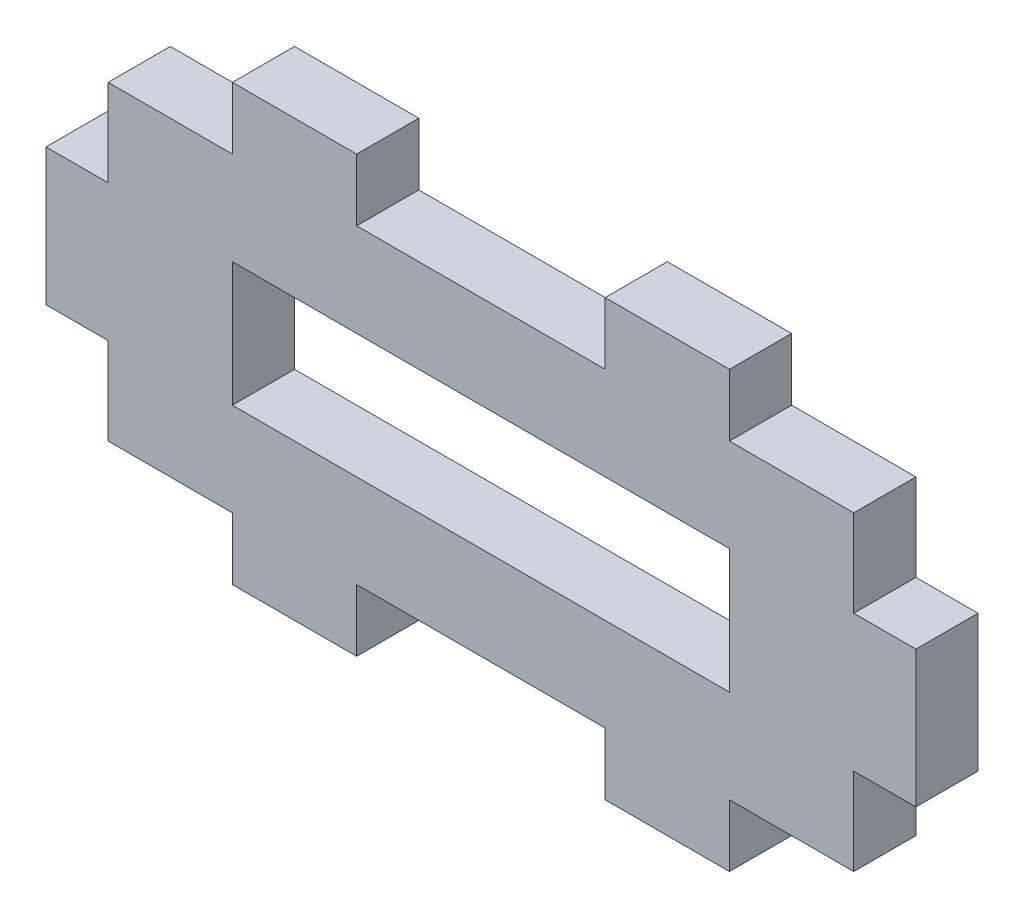
ISO-10303-21;
HEADER;
FILE_DESCRIPTION(('STEP AP214'),'2;1');
FILE_NAME('part.step','',(''),(''),'','','');
FILE_SCHEMA(('AUTOMOTIVE_DESIGN { 1 0 10303 214 1 1 1 1 }'));
ENDSEC;
DATA;
#1=APPLICATION_CONTEXT('core data for automotive mechanical design processes');
#2=APPLICATION_PROTOCOL_DEFINITION('international standard','automotive_design',2000,#1);
#3=PRODUCT_CONTEXT('',#1,'mechanical');
#4=PRODUCT('Part','Part','',(#3));
#5=PRODUCT_RELATED_PRODUCT_CATEGORY('part','',(#4));
#6=PRODUCT_DEFINITION_FORMATION('','',#4);
#7=PRODUCT_DEFINITION_CONTEXT('part definition',#1,'design');
#8=PRODUCT_DEFINITION('design','',#6,#7);
#9=PRODUCT_DEFINITION_SHAPE('','',#8);
#10=(LENGTH_UNIT() NAMED_UNIT(*) SI_UNIT(.MILLI.,.METRE.));
#11=(NAMED_UNIT(*) PLANE_ANGLE_UNIT() SI_UNIT($,.RADIAN.));
#12=(NAMED_UNIT(*) SI_UNIT($,.STERADIAN.) SOLID_ANGLE_UNIT());
#13=UNCERTAINTY_MEASURE_WITH_UNIT(LENGTH_MEASURE(1.E-05),#10,'distance_accuracy_value','');
#14=(GEOMETRIC_REPRESENTATION_CONTEXT(3) GLOBAL_UNCERTAINTY_ASSIGNED_CONTEXT((#13)) GLOBAL_UNIT_ASSIGNED_CONTEXT((#10,
#11,#12)) REPRESENTATION_CONTEXT('',''));
#15=CARTESIAN_POINT('',(0.,0.,0.));
#16=DIRECTION('',(0.,0.,1.));
#17=DIRECTION('',(1.,0.,0.));
#18=AXIS2_PLACEMENT_3D('',#15,#16,#17);
#19=CARTESIAN_POINT('',(0.,0.,5.));
#20=DIRECTION('',(0.,0.,-1.));
#21=DIRECTION('',(-1.,0.,0.));
#22=AXIS2_PLACEMENT_3D('',#19,#20,#21);
#23=PLANE('',#22);
#24=DIRECTION('',(0.,1.,0.));
#25=VECTOR('',#24,1.);
#26=CARTESIAN_POINT('',(30.,5.5,5.));
#27=LINE('',#26,#25);
#28=CARTESIAN_POINT('',(30.,5.5,5.));
#29=VERTEX_POINT('',#28);
#30=CARTESIAN_POINT('',(30.,12.5,5.));
#31=VERTEX_POINT('',#30);
#32=EDGE_CURVE('E278',#29,#31,#27,.T.);
#33=ORIENTED_EDGE('',*,*,#32,.T.);
#34=DIRECTION('',(-1.,0.,0.));
#35=VECTOR('',#34,1.);
#36=CARTESIAN_POINT('',(20.,12.5,5.));
#37=LINE('',#36,#35);
#38=CARTESIAN_POINT('',(20.,12.5,5.));
#39=VERTEX_POINT('',#38);
#40=EDGE_CURVE('E281',#31,#39,#37,.T.);
#41=ORIENTED_EDGE('',*,*,#40,.T.);
#42=DIRECTION('',(0.,1.,0.));
#43=VECTOR('',#42,1.);
#44=CARTESIAN_POINT('',(20.,12.5,5.));
#45=LINE('',#44,#43);
#46=CARTESIAN_POINT('',(20.,17.5,5.));
#47=VERTEX_POINT('',#46);
#48=EDGE_CURVE('E284',#39,#47,#45,.T.);
#49=ORIENTED_EDGE('',*,*,#48,.T.);
#50=DIRECTION('',(-1.,0.,0.));
#51=VECTOR('',#50,1.);
#52=CARTESIAN_POINT('',(20.,17.5,5.));
#53=LINE('',#52,#51);
#54=CARTESIAN_POINT('',(9.99999999999998,17.5,5.));
#55=VERTEX_POINT('',#54);
#56=EDGE_CURVE('E286',#47,#55,#53,.T.);
#57=ORIENTED_EDGE('',*,*,#56,.T.);
#58=DIRECTION('',(0.,-1.,0.));
#59=VECTOR('',#58,1.);
#60=CARTESIAN_POINT('',(9.99999999999998,12.5,5.));
#61=LINE('',#60,#59);
#62=CARTESIAN_POINT('',(9.99999999999998,12.5,5.));
#63=VERTEX_POINT('',#62);
#64=EDGE_CURVE('E288',#55,#63,#61,.T.);
#65=ORIENTED_EDGE('',*,*,#64,.T.);
#66=DIRECTION('',(-1.,0.,0.));
#67=VECTOR('',#66,1.);
#68=CARTESIAN_POINT('',(-10.,12.5,5.));
#69=LINE('',#68,#67);
#70=CARTESIAN_POINT('',(-10.,12.5,5.));
#71=VERTEX_POINT('',#70);
#72=EDGE_CURVE('E290',#63,#71,#69,.T.);
#73=ORIENTED_EDGE('',*,*,#72,.T.);
#74=DIRECTION('',(0.,1.,0.));
#75=VECTOR('',#74,1.);
#76=CARTESIAN_POINT('',(-10.,12.5,5.));
#77=LINE('',#76,#75);
#78=CARTESIAN_POINT('',(-10.,17.5,5.));
#79=VERTEX_POINT('',#78);
#80=EDGE_CURVE('E292',#71,#79,#77,.T.);
#81=ORIENTED_EDGE('',*,*,#80,.T.);
#82=DIRECTION('',(-1.,0.,0.));
#83=VECTOR('',#82,1.);
#84=CARTESIAN_POINT('',(-20.,17.5,5.));
#85=LINE('',#84,#83);
#86=CARTESIAN_POINT('',(-20.,17.5,5.));
#87=VERTEX_POINT('',#86);
#88=EDGE_CURVE('E294',#79,#87,#85,.T.);
#89=ORIENTED_EDGE('',*,*,#88,.T.);
#90=DIRECTION('',(0.,-1.,0.));
#91=VECTOR('',#90,1.);
#92=CARTESIAN_POINT('',(-20.,12.5,5.));
#93=LINE('',#92,#91);
#94=CARTESIAN_POINT('',(-20.,12.5,5.));
#95=VERTEX_POINT('',#94);
#96=EDGE_CURVE('E296',#87,#95,#93,.T.);
#97=ORIENTED_EDGE('',*,*,#96,.T.);
#98=DIRECTION('',(-1.,0.,0.));
#99=VECTOR('',#98,1.);
#100=CARTESIAN_POINT('',(-30.,12.5,5.));
#101=LINE('',#100,#99);
#102=CARTESIAN_POINT('',(-30.,12.5,5.));
#103=VERTEX_POINT('',#102);
#104=EDGE_CURVE('E298',#95,#103,#101,.T.);
#105=ORIENTED_EDGE('',*,*,#104,.T.);
#106=DIRECTION('',(0.,-1.,0.));
#107=VECTOR('',#106,1.);
#108=CARTESIAN_POINT('',(-30.,5.5,5.));
#109=LINE('',#108,#107);
#110=CARTESIAN_POINT('',(-30.,5.5,5.));
#111=VERTEX_POINT('',#110);
#112=EDGE_CURVE('E300',#103,#111,#109,.T.);
#113=ORIENTED_EDGE('',*,*,#112,.T.);
#114=DIRECTION('',(-1.,0.,0.));
#115=VECTOR('',#114,1.);
#116=CARTESIAN_POINT('',(-30.,5.5,5.));
#117=LINE('',#116,#115);
#118=CARTESIAN_POINT('',(-35.,5.5,5.));
#119=VERTEX_POINT('',#118);
#120=EDGE_CURVE('E302',#111,#119,#117,.T.);
#121=ORIENTED_EDGE('',*,*,#120,.T.);
#122=DIRECTION('',(0.,-1.,0.));
#123=VECTOR('',#122,1.);
#124=CARTESIAN_POINT('',(-35.,5.5,5.));
#125=LINE('',#124,#123);
#126=CARTESIAN_POINT('',(-35.,-5.5,5.));
#127=VERTEX_POINT('',#126);
#128=EDGE_CURVE('E304',#119,#127,#125,.T.);
#129=ORIENTED_EDGE('',*,*,#128,.T.);
#130=DIRECTION('',(1.,0.,0.));
#131=VECTOR('',#130,1.);
#132=CARTESIAN_POINT('',(-30.,-5.5,5.));
#133=LINE('',#132,#131);
#134=CARTESIAN_POINT('',(-30.,-5.5,5.));
#135=VERTEX_POINT('',#134);
#136=EDGE_CURVE('E306',#127,#135,#133,.T.);
#137=ORIENTED_EDGE('',*,*,#136,.T.);
#138=DIRECTION('',(0.,-1.,0.));
#139=VECTOR('',#138,1.);
#140=CARTESIAN_POINT('',(-30.,-12.5,5.));
#141=LINE('',#140,#139);
#142=CARTESIAN_POINT('',(-30.,-12.5,5.));
#143=VERTEX_POINT('',#142);
#144=EDGE_CURVE('E308',#135,#143,#141,.T.);
#145=ORIENTED_EDGE('',*,*,#144,.T.);
#146=DIRECTION('',(1.,0.,0.));
#147=VECTOR('',#146,1.);
#148=CARTESIAN_POINT('',(-30.,-12.5,5.));
#149=LINE('',#148,#147);
#150=CARTESIAN_POINT('',(-20.,-12.5,5.));
#151=VERTEX_POINT('',#150);
#152=EDGE_CURVE('E310',#143,#151,#149,.T.);
#153=ORIENTED_EDGE('',*,*,#152,.T.);
#154=DIRECTION('',(0.,-1.,0.));
#155=VECTOR('',#154,1.);
#156=CARTESIAN_POINT('',(-20.,-12.5,5.));
#157=LINE('',#156,#155);
#158=CARTESIAN_POINT('',(-20.,-17.5,5.));
#159=VERTEX_POINT('',#158);
#160=EDGE_CURVE('E312',#151,#159,#157,.T.);
#161=ORIENTED_EDGE('',*,*,#160,.T.);
#162=DIRECTION('',(1.,0.,0.));
#163=VECTOR('',#162,1.);
#164=CARTESIAN_POINT('',(-20.,-17.5,5.));
#165=LINE('',#164,#163);
#166=CARTESIAN_POINT('',(-10.,-17.5,5.));
#167=VERTEX_POINT('',#166);
#168=EDGE_CURVE('E314',#159,#167,#165,.T.);
#169=ORIENTED_EDGE('',*,*,#168,.T.);
#170=DIRECTION('',(0.,1.,0.));
#171=VECTOR('',#170,1.);
#172=CARTESIAN_POINT('',(-10.,-12.5,5.));
#173=LINE('',#172,#171);
#174=CARTESIAN_POINT('',(-10.,-12.5,5.));
#175=VERTEX_POINT('',#174);
#176=EDGE_CURVE('E316',#167,#175,#173,.T.);
#177=ORIENTED_EDGE('',*,*,#176,.T.);
#178=DIRECTION('',(1.,0.,0.));
#179=VECTOR('',#178,1.);
#180=CARTESIAN_POINT('',(-10.,-12.5,5.));
#181=LINE('',#180,#179);
#182=CARTESIAN_POINT('',(9.99999999999998,-12.5,5.));
#183=VERTEX_POINT('',#182);
#184=EDGE_CURVE('E318',#175,#183,#181,.T.);
#185=ORIENTED_EDGE('',*,*,#184,.T.);
#186=DIRECTION('',(0.,-1.,0.));
#187=VECTOR('',#186,1.);
#188=CARTESIAN_POINT('',(9.99999999999998,-12.5,5.));
#189=LINE('',#188,#187);
#190=CARTESIAN_POINT('',(9.99999999999998,-17.5,5.));
#191=VERTEX_POINT('',#190);
#192=EDGE_CURVE('E320',#183,#191,#189,.T.);
#193=ORIENTED_EDGE('',*,*,#192,.T.);
#194=DIRECTION('',(1.,0.,0.));
#195=VECTOR('',#194,1.);
#196=CARTESIAN_POINT('',(20.,-17.5,5.));
#197=LINE('',#196,#195);
#198=CARTESIAN_POINT('',(20.,-17.5,5.));
#199=VERTEX_POINT('',#198);
#200=EDGE_CURVE('E322',#191,#199,#197,.T.);
#201=ORIENTED_EDGE('',*,*,#200,.T.);
#202=DIRECTION('',(0.,1.,0.));
#203=VECTOR('',#202,1.);
#204=CARTESIAN_POINT('',(20.,-12.5,5.));
#205=LINE('',#204,#203);
#206=CARTESIAN_POINT('',(20.,-12.5,5.));
#207=VERTEX_POINT('',#206);
#208=EDGE_CURVE('E324',#199,#207,#205,.T.);
#209=ORIENTED_EDGE('',*,*,#208,.T.);
#210=DIRECTION('',(1.,0.,0.));
#211=VECTOR('',#210,1.);
#212=CARTESIAN_POINT('',(20.,-12.5,5.));
#213=LINE('',#212,#211);
#214=CARTESIAN_POINT('',(30.,-12.5,5.));
#215=VERTEX_POINT('',#214);
#216=EDGE_CURVE('E326',#207,#215,#213,.T.);
#217=ORIENTED_EDGE('',*,*,#216,.T.);
#218=DIRECTION('',(0.,1.,0.));
#219=VECTOR('',#218,1.);
#220=CARTESIAN_POINT('',(30.,-12.5,5.));
#221=LINE('',#220,#219);
#222=CARTESIAN_POINT('',(30.,-5.5,5.));
#223=VERTEX_POINT('',#222);
#224=EDGE_CURVE('E328',#215,#223,#221,.T.);
#225=ORIENTED_EDGE('',*,*,#224,.T.);
#226=DIRECTION('',(1.,0.,0.));
#227=VECTOR('',#226,1.);
#228=CARTESIAN_POINT('',(30.,-5.5,5.));
#229=LINE('',#228,#227);
#230=CARTESIAN_POINT('',(35.,-5.5,5.));
#231=VERTEX_POINT('',#230);
#232=EDGE_CURVE('E330',#223,#231,#229,.T.);
#233=ORIENTED_EDGE('',*,*,#232,.T.);
#234=DIRECTION('',(0.,1.,0.));
#235=VECTOR('',#234,1.);
#236=CARTESIAN_POINT('',(35.,5.5,5.));
#237=LINE('',#236,#235);
#238=CARTESIAN_POINT('',(35.,5.5,5.));
#239=VERTEX_POINT('',#238);
#240=EDGE_CURVE('E332',#231,#239,#237,.T.);
#241=ORIENTED_EDGE('',*,*,#240,.T.);
#242=DIRECTION('',(-1.,0.,0.));
#243=VECTOR('',#242,1.);
#244=CARTESIAN_POINT('',(30.,5.5,5.));
#245=LINE('',#244,#243);
#246=EDGE_CURVE('E334',#239,#29,#245,.T.);
#247=ORIENTED_EDGE('',*,*,#246,.T.);
#248=EDGE_LOOP('',(#33,#41,#49,#57,#65,#73,#81,#89,#97,#105,#113,#121,#129,#137,#145,#153,#161,
#169,#177,#185,#193,#201,#209,#217,#225,#233,#241,#247));
#249=FACE_BOUND('',#248,.T.);
#250=DIRECTION('',(0.,1.,0.));
#251=VECTOR('',#250,1.);
#252=CARTESIAN_POINT('',(20.,-5.,5.));
#253=LINE('',#252,#251);
#254=CARTESIAN_POINT('',(20.,-5.,5.));
#255=VERTEX_POINT('',#254);
#256=CARTESIAN_POINT('',(20.,5.,5.));
#257=VERTEX_POINT('',#256);
#258=EDGE_CURVE('E242',#255,#257,#253,.T.);
#259=ORIENTED_EDGE('',*,*,#258,.F.);
#260=DIRECTION('',(1.,0.,0.));
#261=VECTOR('',#260,1.);
#262=CARTESIAN_POINT('',(-20.,-5.,5.));
#263=LINE('',#262,#261);
#264=CARTESIAN_POINT('',(-20.,-5.,5.));
#265=VERTEX_POINT('',#264);
#266=EDGE_CURVE('E264',#265,#255,#263,.T.);
#267=ORIENTED_EDGE('',*,*,#266,.F.);
#268=DIRECTION('',(0.,-1.,0.));
#269=VECTOR('',#268,1.);
#270=CARTESIAN_POINT('',(-20.,-5.,5.));
#271=LINE('',#270,#269);
#272=CARTESIAN_POINT('',(-20.,5.,5.));
#273=VERTEX_POINT('',#272);
#274=EDGE_CURVE('E262',#273,#265,#271,.T.);
#275=ORIENTED_EDGE('',*,*,#274,.F.);
#276=DIRECTION('',(-1.,0.,0.));
#277=VECTOR('',#276,1.);
#278=CARTESIAN_POINT('',(-20.,5.,5.));
#279=LINE('',#278,#277);
#280=EDGE_CURVE('E250',#257,#273,#279,.T.);
#281=ORIENTED_EDGE('',*,*,#280,.F.);
#282=EDGE_LOOP('',(#259,#267,#275,#281));
#283=FACE_BOUND('',#282,.T.);
#284=ADVANCED_FACE('F33',(#249,#283),#23,.F.);
#285=CARTESIAN_POINT('',(0.,0.,0.));
#286=DIRECTION('',(0.,0.,-1.));
#287=DIRECTION('',(-1.,0.,0.));
#288=AXIS2_PLACEMENT_3D('',#285,#286,#287);
#289=PLANE('',#288);
#290=DIRECTION('',(0.,1.,0.));
#291=VECTOR('',#290,1.);
#292=CARTESIAN_POINT('',(30.,5.5,0.));
#293=LINE('',#292,#291);
#294=CARTESIAN_POINT('',(30.,5.5,0.));
#295=VERTEX_POINT('',#294);
#296=CARTESIAN_POINT('',(30.,12.5,0.));
#297=VERTEX_POINT('',#296);
#298=EDGE_CURVE('E258',#295,#297,#293,.T.);
#299=ORIENTED_EDGE('',*,*,#298,.F.);
#300=DIRECTION('',(-1.,0.,0.));
#301=VECTOR('',#300,1.);
#302=CARTESIAN_POINT('',(30.,5.5,0.));
#303=LINE('',#302,#301);
#304=CARTESIAN_POINT('',(35.,5.5,0.));
#305=VERTEX_POINT('',#304);
#306=EDGE_CURVE('E282',#305,#295,#303,.T.);
#307=ORIENTED_EDGE('',*,*,#306,.F.);
#308=DIRECTION('',(0.,1.,0.));
#309=VECTOR('',#308,1.);
#310=CARTESIAN_POINT('',(35.,5.5,0.));
#311=LINE('',#310,#309);
#312=CARTESIAN_POINT('',(35.,-5.5,0.));
#313=VERTEX_POINT('',#312);
#314=EDGE_CURVE('E389',#313,#305,#311,.T.);
#315=ORIENTED_EDGE('',*,*,#314,.F.);
#316=DIRECTION('',(1.,0.,0.));
#317=VECTOR('',#316,1.);
#318=CARTESIAN_POINT('',(30.,-5.5,0.));
#319=LINE('',#318,#317);
#320=CARTESIAN_POINT('',(30.,-5.5,0.));
#321=VERTEX_POINT('',#320);
#322=EDGE_CURVE('E387',#321,#313,#319,.T.);
#323=ORIENTED_EDGE('',*,*,#322,.F.);
#324=DIRECTION('',(0.,1.,0.));
#325=VECTOR('',#324,1.);
#326=CARTESIAN_POINT('',(30.,-12.5,0.));
#327=LINE('',#326,#325);
#328=CARTESIAN_POINT('',(30.,-12.5,0.));
#329=VERTEX_POINT('',#328);
#330=EDGE_CURVE('E385',#329,#321,#327,.T.);
#331=ORIENTED_EDGE('',*,*,#330,.F.);
#332=DIRECTION('',(1.,0.,0.));
#333=VECTOR('',#332,1.);
#334=CARTESIAN_POINT('',(20.,-12.5,0.));
#335=LINE('',#334,#333);
#336=CARTESIAN_POINT('',(20.,-12.5,0.));
#337=VERTEX_POINT('',#336);
#338=EDGE_CURVE('E383',#337,#329,#335,.T.);
#339=ORIENTED_EDGE('',*,*,#338,.F.);
#340=DIRECTION('',(0.,1.,0.));
#341=VECTOR('',#340,1.);
#342=CARTESIAN_POINT('',(20.,-12.5,0.));
#343=LINE('',#342,#341);
#344=CARTESIAN_POINT('',(20.,-17.5,0.));
#345=VERTEX_POINT('',#344);
#346=EDGE_CURVE('E381',#345,#337,#343,.T.);
#347=ORIENTED_EDGE('',*,*,#346,.F.);
#348=DIRECTION('',(1.,0.,0.));
#349=VECTOR('',#348,1.);
#350=CARTESIAN_POINT('',(20.,-17.5,0.));
#351=LINE('',#350,#349);
#352=CARTESIAN_POINT('',(9.99999999999998,-17.5,0.));
#353=VERTEX_POINT('',#352);
#354=EDGE_CURVE('E379',#353,#345,#351,.T.);
#355=ORIENTED_EDGE('',*,*,#354,.F.);
#356=DIRECTION('',(0.,-1.,0.));
#357=VECTOR('',#356,1.);
#358=CARTESIAN_POINT('',(9.99999999999998,-12.5,0.));
#359=LINE('',#358,#357);
#360=CARTESIAN_POINT('',(9.99999999999998,-12.5,0.));
#361=VERTEX_POINT('',#360);
#362=EDGE_CURVE('E377',#361,#353,#359,.T.);
#363=ORIENTED_EDGE('',*,*,#362,.F.);
#364=DIRECTION('',(1.,0.,0.));
#365=VECTOR('',#364,1.);
#366=CARTESIAN_POINT('',(-10.,-12.5,0.));
#367=LINE('',#366,#365);
#368=CARTESIAN_POINT('',(-10.,-12.5,0.));
#369=VERTEX_POINT('',#368);
#370=EDGE_CURVE('E375',#369,#361,#367,.T.);
#371=ORIENTED_EDGE('',*,*,#370,.F.);
#372=DIRECTION('',(0.,1.,0.));
#373=VECTOR('',#372,1.);
#374=CARTESIAN_POINT('',(-10.,-12.5,0.));
#375=LINE('',#374,#373);
#376=CARTESIAN_POINT('',(-10.,-17.5,0.));
#377=VERTEX_POINT('',#376);
#378=EDGE_CURVE('E373',#377,#369,#375,.T.);
#379=ORIENTED_EDGE('',*,*,#378,.F.);
#380=DIRECTION('',(1.,0.,0.));
#381=VECTOR('',#380,1.);
#382=CARTESIAN_POINT('',(-20.,-17.5,0.));
#383=LINE('',#382,#381);
#384=CARTESIAN_POINT('',(-20.,-17.5,0.));
#385=VERTEX_POINT('',#384);
#386=EDGE_CURVE('E371',#385,#377,#383,.T.);
#387=ORIENTED_EDGE('',*,*,#386,.F.);
#388=DIRECTION('',(0.,-1.,0.));
#389=VECTOR('',#388,1.);
#390=CARTESIAN_POINT('',(-20.,-12.5,0.));
#391=LINE('',#390,#389);
#392=CARTESIAN_POINT('',(-20.,-12.5,0.));
#393=VERTEX_POINT('',#392);
#394=EDGE_CURVE('E369',#393,#385,#391,.T.);
#395=ORIENTED_EDGE('',*,*,#394,.F.);
#396=DIRECTION('',(1.,0.,0.));
#397=VECTOR('',#396,1.);
#398=CARTESIAN_POINT('',(-30.,-12.5,0.));
#399=LINE('',#398,#397);
#400=CARTESIAN_POINT('',(-30.,-12.5,0.));
#401=VERTEX_POINT('',#400);
#402=EDGE_CURVE('E367',#401,#393,#399,.T.);
#403=ORIENTED_EDGE('',*,*,#402,.F.);
#404=DIRECTION('',(0.,-1.,0.));
#405=VECTOR('',#404,1.);
#406=CARTESIAN_POINT('',(-30.,-12.5,0.));
#407=LINE('',#406,#405);
#408=CARTESIAN_POINT('',(-30.,-5.5,0.));
#409=VERTEX_POINT('',#408);
#410=EDGE_CURVE('E365',#409,#401,#407,.T.);
#411=ORIENTED_EDGE('',*,*,#410,.F.);
#412=DIRECTION('',(1.,0.,0.));
#413=VECTOR('',#412,1.);
#414=CARTESIAN_POINT('',(-30.,-5.5,0.));
#415=LINE('',#414,#413);
#416=CARTESIAN_POINT('',(-35.,-5.5,0.));
#417=VERTEX_POINT('',#416);
#418=EDGE_CURVE('E363',#417,#409,#415,.T.);
#419=ORIENTED_EDGE('',*,*,#418,.F.);
#420=DIRECTION('',(0.,-1.,0.));
#421=VECTOR('',#420,1.);
#422=CARTESIAN_POINT('',(-35.,5.5,0.));
#423=LINE('',#422,#421);
#424=CARTESIAN_POINT('',(-35.,5.5,0.));
#425=VERTEX_POINT('',#424);
#426=EDGE_CURVE('E361',#425,#417,#423,.T.);
#427=ORIENTED_EDGE('',*,*,#426,.F.);
#428=DIRECTION('',(-1.,0.,0.));
#429=VECTOR('',#428,1.);
#430=CARTESIAN_POINT('',(-30.,5.5,0.));
#431=LINE('',#430,#429);
#432=CARTESIAN_POINT('',(-30.,5.5,0.));
#433=VERTEX_POINT('',#432);
#434=EDGE_CURVE('E359',#433,#425,#431,.T.);
#435=ORIENTED_EDGE('',*,*,#434,.F.);
#436=DIRECTION('',(0.,-1.,0.));
#437=VECTOR('',#436,1.);
#438=CARTESIAN_POINT('',(-30.,5.5,0.));
#439=LINE('',#438,#437);
#440=CARTESIAN_POINT('',(-30.,12.5,0.));
#441=VERTEX_POINT('',#440);
#442=EDGE_CURVE('E357',#441,#433,#439,.T.);
#443=ORIENTED_EDGE('',*,*,#442,.F.);
#444=DIRECTION('',(-1.,0.,0.));
#445=VECTOR('',#444,1.);
#446=CARTESIAN_POINT('',(-30.,12.5,0.));
#447=LINE('',#446,#445);
#448=CARTESIAN_POINT('',(-20.,12.5,0.));
#449=VERTEX_POINT('',#448);
#450=EDGE_CURVE('E355',#449,#441,#447,.T.);
#451=ORIENTED_EDGE('',*,*,#450,.F.);
#452=DIRECTION('',(0.,-1.,0.));
#453=VECTOR('',#452,1.);
#454=CARTESIAN_POINT('',(-20.,12.5,0.));
#455=LINE('',#454,#453);
#456=CARTESIAN_POINT('',(-20.,17.5,0.));
#457=VERTEX_POINT('',#456);
#458=EDGE_CURVE('E353',#457,#449,#455,.T.);
#459=ORIENTED_EDGE('',*,*,#458,.F.);
#460=DIRECTION('',(-1.,0.,0.));
#461=VECTOR('',#460,1.);
#462=CARTESIAN_POINT('',(-20.,17.5,0.));
#463=LINE('',#462,#461);
#464=CARTESIAN_POINT('',(-10.,17.5,0.));
#465=VERTEX_POINT('',#464);
#466=EDGE_CURVE('E351',#465,#457,#463,.T.);
#467=ORIENTED_EDGE('',*,*,#466,.F.);
#468=DIRECTION('',(0.,1.,0.));
#469=VECTOR('',#468,1.);
#470=CARTESIAN_POINT('',(-10.,12.5,0.));
#471=LINE('',#470,#469);
#472=CARTESIAN_POINT('',(-10.,12.5,0.));
#473=VERTEX_POINT('',#472);
#474=EDGE_CURVE('E349',#473,#465,#471,.T.);
#475=ORIENTED_EDGE('',*,*,#474,.F.);
#476=DIRECTION('',(-1.,0.,0.));
#477=VECTOR('',#476,1.);
#478=CARTESIAN_POINT('',(-10.,12.5,0.));
#479=LINE('',#478,#477);
#480=CARTESIAN_POINT('',(9.99999999999998,12.5,0.));
#481=VERTEX_POINT('',#480);
#482=EDGE_CURVE('E347',#481,#473,#479,.T.);
#483=ORIENTED_EDGE('',*,*,#482,.F.);
#484=DIRECTION('',(0.,-1.,0.));
#485=VECTOR('',#484,1.);
#486=CARTESIAN_POINT('',(9.99999999999998,12.5,0.));
#487=LINE('',#486,#485);
#488=CARTESIAN_POINT('',(9.99999999999998,17.5,0.));
#489=VERTEX_POINT('',#488);
#490=EDGE_CURVE('E345',#489,#481,#487,.T.);
#491=ORIENTED_EDGE('',*,*,#490,.F.);
#492=DIRECTION('',(-1.,0.,0.));
#493=VECTOR('',#492,1.);
#494=CARTESIAN_POINT('',(20.,17.5,0.));
#495=LINE('',#494,#493);
#496=CARTESIAN_POINT('',(20.,17.5,0.));
#497=VERTEX_POINT('',#496);
#498=EDGE_CURVE('E343',#497,#489,#495,.T.);
#499=ORIENTED_EDGE('',*,*,#498,.F.);
#500=DIRECTION('',(0.,1.,0.));
#501=VECTOR('',#500,1.);
#502=CARTESIAN_POINT('',(20.,12.5,0.));
#503=LINE('',#502,#501);
#504=CARTESIAN_POINT('',(20.,12.5,0.));
#505=VERTEX_POINT('',#504);
#506=EDGE_CURVE('E341',#505,#497,#503,.T.);
#507=ORIENTED_EDGE('',*,*,#506,.F.);
#508=DIRECTION('',(-1.,0.,0.));
#509=VECTOR('',#508,1.);
#510=CARTESIAN_POINT('',(20.,12.5,0.));
#511=LINE('',#510,#509);
#512=EDGE_CURVE('E339',#297,#505,#511,.T.);
#513=ORIENTED_EDGE('',*,*,#512,.F.);
#514=EDGE_LOOP('',(#299,#307,#315,#323,#331,#339,#347,#355,#363,#371,#379,#387,#395,#403,#411,
#419,#427,#435,#443,#451,#459,#467,#475,#483,#491,#499,#507,#513));
#515=FACE_BOUND('',#514,.T.);
#516=DIRECTION('',(1.,0.,0.));
#517=VECTOR('',#516,1.);
#518=CARTESIAN_POINT('',(-20.,-5.,0.));
#519=LINE('',#518,#517);
#520=CARTESIAN_POINT('',(-20.,-5.,0.));
#521=VERTEX_POINT('',#520);
#522=CARTESIAN_POINT('',(20.,-5.,0.));
#523=VERTEX_POINT('',#522);
#524=EDGE_CURVE('E251',#521,#523,#519,.T.);
#525=ORIENTED_EDGE('',*,*,#524,.T.);
#526=DIRECTION('',(0.,1.,0.));
#527=VECTOR('',#526,1.);
#528=CARTESIAN_POINT('',(20.,-5.,0.));
#529=LINE('',#528,#527);
#530=CARTESIAN_POINT('',(20.,5.,0.));
#531=VERTEX_POINT('',#530);
#532=EDGE_CURVE('E56',#523,#531,#529,.T.);
#533=ORIENTED_EDGE('',*,*,#532,.T.);
#534=DIRECTION('',(-1.,0.,0.));
#535=VECTOR('',#534,1.);
#536=CARTESIAN_POINT('',(-20.,5.,0.));
#537=LINE('',#536,#535);
#538=CARTESIAN_POINT('',(-20.,5.,0.));
#539=VERTEX_POINT('',#538);
#540=EDGE_CURVE('E257',#531,#539,#537,.T.);
#541=ORIENTED_EDGE('',*,*,#540,.T.);
#542=DIRECTION('',(0.,-1.,0.));
#543=VECTOR('',#542,1.);
#544=CARTESIAN_POINT('',(-20.,-5.,0.));
#545=LINE('',#544,#543);
#546=EDGE_CURVE('E270',#539,#521,#545,.T.);
#547=ORIENTED_EDGE('',*,*,#546,.T.);
#548=EDGE_LOOP('',(#525,#533,#541,#547));
#549=FACE_BOUND('',#548,.T.);
#550=ADVANCED_FACE('F479',(#515,#549),#289,.T.);
#551=CARTESIAN_POINT('',(30.,5.5,5.));
#552=DIRECTION('',(-1.,0.,0.));
#553=DIRECTION('',(0.,-1.,0.));
#554=AXIS2_PLACEMENT_3D('',#551,#552,#553);
#555=PLANE('',#554);
#556=ORIENTED_EDGE('',*,*,#298,.T.);
#557=DIRECTION('',(0.,0.,-1.));
#558=VECTOR('',#557,1.);
#559=CARTESIAN_POINT('',(30.,12.5,5.));
#560=LINE('',#559,#558);
#561=EDGE_CURVE('E11',#31,#297,#560,.T.);
#562=ORIENTED_EDGE('',*,*,#561,.F.);
#563=ORIENTED_EDGE('',*,*,#32,.F.);
#564=DIRECTION('',(0.,0.,-1.));
#565=VECTOR('',#564,1.);
#566=CARTESIAN_POINT('',(30.,5.5,5.));
#567=LINE('',#566,#565);
#568=EDGE_CURVE('E336',#29,#295,#567,.T.);
#569=ORIENTED_EDGE('',*,*,#568,.T.);
#570=EDGE_LOOP('',(#556,#562,#563,#569));
#571=FACE_BOUND('',#570,.T.);
#572=ADVANCED_FACE('F35',(#571),#555,.F.);
#573=CARTESIAN_POINT('',(20.,12.5,5.));
#574=DIRECTION('',(0.,-1.,0.));
#575=DIRECTION('',(0.,0.,-1.));
#576=AXIS2_PLACEMENT_3D('',#573,#574,#575);
#577=PLANE('',#576);
#578=ORIENTED_EDGE('',*,*,#512,.T.);
#579=DIRECTION('',(0.,0.,-1.));
#580=VECTOR('',#579,1.);
#581=CARTESIAN_POINT('',(20.,12.5,5.));
#582=LINE('',#581,#580);
#583=EDGE_CURVE('E41',#39,#505,#582,.T.);
#584=ORIENTED_EDGE('',*,*,#583,.F.);
#585=ORIENTED_EDGE('',*,*,#40,.F.);
#586=ORIENTED_EDGE('',*,*,#561,.T.);
#587=EDGE_LOOP('',(#578,#584,#585,#586));
#588=FACE_BOUND('',#587,.T.);
#589=ADVANCED_FACE('F496',(#588),#577,.F.);
#590=CARTESIAN_POINT('',(20.,12.5,5.));
#591=DIRECTION('',(-1.,0.,0.));
#592=DIRECTION('',(0.,0.,1.));
#593=AXIS2_PLACEMENT_3D('',#590,#591,#592);
#594=PLANE('',#593);
#595=ORIENTED_EDGE('',*,*,#506,.T.);
#596=DIRECTION('',(0.,0.,-1.));
#597=VECTOR('',#596,1.);
#598=CARTESIAN_POINT('',(20.,17.5,5.));
#599=LINE('',#598,#597);
#600=EDGE_CURVE('E466',#47,#497,#599,.T.);
#601=ORIENTED_EDGE('',*,*,#600,.F.);
#602=ORIENTED_EDGE('',*,*,#48,.F.);
#603=ORIENTED_EDGE('',*,*,#583,.T.);
#604=EDGE_LOOP('',(#595,#601,#602,#603));
#605=FACE_BOUND('',#604,.T.);
#606=ADVANCED_FACE('F473',(#605),#594,.F.);
#607=CARTESIAN_POINT('',(20.,17.5,5.));
#608=DIRECTION('',(0.,-1.,0.));
#609=DIRECTION('',(0.,0.,-1.));
#610=AXIS2_PLACEMENT_3D('',#607,#608,#609);
#611=PLANE('',#610);
#612=ORIENTED_EDGE('',*,*,#498,.T.);
#613=DIRECTION('',(0.,0.,-1.));
#614=VECTOR('',#613,1.);
#615=CARTESIAN_POINT('',(9.99999999999998,17.5,5.));
#616=LINE('',#615,#614);
#617=EDGE_CURVE('E463',#55,#489,#616,.T.);
#618=ORIENTED_EDGE('',*,*,#617,.F.);
#619=ORIENTED_EDGE('',*,*,#56,.F.);
#620=ORIENTED_EDGE('',*,*,#600,.T.);
#621=EDGE_LOOP('',(#612,#618,#619,#620));
#622=FACE_BOUND('',#621,.T.);
#623=ADVANCED_FACE('F485',(#622),#611,.F.);
#624=CARTESIAN_POINT('',(9.99999999999998,12.5,5.));
#625=DIRECTION('',(1.,0.,0.));
#626=DIRECTION('',(0.,0.,-1.));
#627=AXIS2_PLACEMENT_3D('',#624,#625,#626);
#628=PLANE('',#627);
#629=ORIENTED_EDGE('',*,*,#490,.T.);
#630=DIRECTION('',(0.,0.,-1.));
#631=VECTOR('',#630,1.);
#632=CARTESIAN_POINT('',(9.99999999999998,12.5,5.));
#633=LINE('',#632,#631);
#634=EDGE_CURVE('E460',#63,#481,#633,.T.);
#635=ORIENTED_EDGE('',*,*,#634,.F.);
#636=ORIENTED_EDGE('',*,*,#64,.F.);
#637=ORIENTED_EDGE('',*,*,#617,.T.);
#638=EDGE_LOOP('',(#629,#635,#636,#637));
#639=FACE_BOUND('',#638,.T.);
#640=ADVANCED_FACE('F489',(#639),#628,.F.);
#641=CARTESIAN_POINT('',(-10.,12.5,5.));
#642=DIRECTION('',(0.,-1.,0.));
#643=DIRECTION('',(0.,0.,-1.));
#644=AXIS2_PLACEMENT_3D('',#641,#642,#643);
#645=PLANE('',#644);
#646=ORIENTED_EDGE('',*,*,#482,.T.);
#647=DIRECTION('',(0.,0.,-1.));
#648=VECTOR('',#647,1.);
#649=CARTESIAN_POINT('',(-10.,12.5,5.));
#650=LINE('',#649,#648);
#651=EDGE_CURVE('E457',#71,#473,#650,.T.);
#652=ORIENTED_EDGE('',*,*,#651,.F.);
#653=ORIENTED_EDGE('',*,*,#72,.F.);
#654=ORIENTED_EDGE('',*,*,#634,.T.);
#655=EDGE_LOOP('',(#646,#652,#653,#654));
#656=FACE_BOUND('',#655,.T.);
#657=ADVANCED_FACE('F609',(#656),#645,.F.);
#658=CARTESIAN_POINT('',(-10.,12.5,5.));
#659=DIRECTION('',(-1.,0.,0.));
#660=DIRECTION('',(0.,0.,1.));
#661=AXIS2_PLACEMENT_3D('',#658,#659,#660);
#662=PLANE('',#661);
#663=ORIENTED_EDGE('',*,*,#474,.T.);
#664=DIRECTION('',(0.,0.,-1.));
#665=VECTOR('',#664,1.);
#666=CARTESIAN_POINT('',(-10.,17.5,5.));
#667=LINE('',#666,#665);
#668=EDGE_CURVE('E454',#79,#465,#667,.T.);
#669=ORIENTED_EDGE('',*,*,#668,.F.);
#670=ORIENTED_EDGE('',*,*,#80,.F.);
#671=ORIENTED_EDGE('',*,*,#651,.T.);
#672=EDGE_LOOP('',(#663,#669,#670,#671));
#673=FACE_BOUND('',#672,.T.);
#674=ADVANCED_FACE('F606',(#673),#662,.F.);
#675=CARTESIAN_POINT('',(-20.,17.5,5.));
#676=DIRECTION('',(0.,-1.,0.));
#677=DIRECTION('',(0.,0.,-1.));
#678=AXIS2_PLACEMENT_3D('',#675,#676,#677);
#679=PLANE('',#678);
#680=ORIENTED_EDGE('',*,*,#466,.T.);
#681=DIRECTION('',(0.,0.,-1.));
#682=VECTOR('',#681,1.);
#683=CARTESIAN_POINT('',(-20.,17.5,5.));
#684=LINE('',#683,#682);
#685=EDGE_CURVE('E451',#87,#457,#684,.T.);
#686=ORIENTED_EDGE('',*,*,#685,.F.);
#687=ORIENTED_EDGE('',*,*,#88,.F.);
#688=ORIENTED_EDGE('',*,*,#668,.T.);
#689=EDGE_LOOP('',(#680,#686,#687,#688));
#690=FACE_BOUND('',#689,.T.);
#691=ADVANCED_FACE('F602',(#690),#679,.F.);
#692=CARTESIAN_POINT('',(-20.,12.5,5.));
#693=DIRECTION('',(1.,0.,0.));
#694=DIRECTION('',(0.,0.,-1.));
#695=AXIS2_PLACEMENT_3D('',#692,#693,#694);
#696=PLANE('',#695);
#697=ORIENTED_EDGE('',*,*,#458,.T.);
#698=DIRECTION('',(0.,0.,-1.));
#699=VECTOR('',#698,1.);
#700=CARTESIAN_POINT('',(-20.,12.5,5.));
#701=LINE('',#700,#699);
#702=EDGE_CURVE('E448',#95,#449,#701,.T.);
#703=ORIENTED_EDGE('',*,*,#702,.F.);
#704=ORIENTED_EDGE('',*,*,#96,.F.);
#705=ORIENTED_EDGE('',*,*,#685,.T.);
#706=EDGE_LOOP('',(#697,#703,#704,#705));
#707=FACE_BOUND('',#706,.T.);
#708=ADVANCED_FACE('F598',(#707),#696,.F.);
#709=CARTESIAN_POINT('',(-30.,12.5,5.));
#710=DIRECTION('',(0.,-1.,0.));
#711=DIRECTION('',(0.,0.,-1.));
#712=AXIS2_PLACEMENT_3D('',#709,#710,#711);
#713=PLANE('',#712);
#714=ORIENTED_EDGE('',*,*,#450,.T.);
#715=DIRECTION('',(0.,0.,-1.));
#716=VECTOR('',#715,1.);
#717=CARTESIAN_POINT('',(-30.,12.5,5.));
#718=LINE('',#717,#716);
#719=EDGE_CURVE('E445',#103,#441,#718,.T.);
#720=ORIENTED_EDGE('',*,*,#719,.F.);
#721=ORIENTED_EDGE('',*,*,#104,.F.);
#722=ORIENTED_EDGE('',*,*,#702,.T.);
#723=EDGE_LOOP('',(#714,#720,#721,#722));
#724=FACE_BOUND('',#723,.T.);
#725=ADVANCED_FACE('F593',(#724),#713,.F.);
#726=CARTESIAN_POINT('',(-30.,5.5,5.));
#727=DIRECTION('',(1.,0.,0.));
#728=DIRECTION('',(0.,0.,-1.));
#729=AXIS2_PLACEMENT_3D('',#726,#727,#728);
#730=PLANE('',#729);
#731=ORIENTED_EDGE('',*,*,#442,.T.);
#732=DIRECTION('',(0.,0.,-1.));
#733=VECTOR('',#732,1.);
#734=CARTESIAN_POINT('',(-30.,5.5,5.));
#735=LINE('',#734,#733);
#736=EDGE_CURVE('E442',#111,#433,#735,.T.);
#737=ORIENTED_EDGE('',*,*,#736,.F.);
#738=ORIENTED_EDGE('',*,*,#112,.F.);
#739=ORIENTED_EDGE('',*,*,#719,.T.);
#740=EDGE_LOOP('',(#731,#737,#738,#739));
#741=FACE_BOUND('',#740,.T.);
#742=ADVANCED_FACE('F587',(#741),#730,.F.);
#743=CARTESIAN_POINT('',(-30.,5.5,5.));
#744=DIRECTION('',(0.,-1.,0.));
#745=DIRECTION('',(0.,0.,-1.));
#746=AXIS2_PLACEMENT_3D('',#743,#744,#745);
#747=PLANE('',#746);
#748=ORIENTED_EDGE('',*,*,#434,.T.);
#749=DIRECTION('',(0.,0.,-1.));
#750=VECTOR('',#749,1.);
#751=CARTESIAN_POINT('',(-35.,5.5,5.));
#752=LINE('',#751,#750);
#753=EDGE_CURVE('E439',#119,#425,#752,.T.);
#754=ORIENTED_EDGE('',*,*,#753,.F.);
#755=ORIENTED_EDGE('',*,*,#120,.F.);
#756=ORIENTED_EDGE('',*,*,#736,.T.);
#757=EDGE_LOOP('',(#748,#754,#755,#756));
#758=FACE_BOUND('',#757,.T.);
#759=ADVANCED_FACE('F583',(#758),#747,.F.);
#760=CARTESIAN_POINT('',(-35.,5.5,5.));
#761=DIRECTION('',(1.,0.,0.));
#762=DIRECTION('',(0.,0.,-1.));
#763=AXIS2_PLACEMENT_3D('',#760,#761,#762);
#764=PLANE('',#763);
#765=ORIENTED_EDGE('',*,*,#426,.T.);
#766=DIRECTION('',(0.,0.,-1.));
#767=VECTOR('',#766,1.);
#768=CARTESIAN_POINT('',(-35.,-5.5,5.));
#769=LINE('',#768,#767);
#770=EDGE_CURVE('E436',#127,#417,#769,.T.);
#771=ORIENTED_EDGE('',*,*,#770,.F.);
#772=ORIENTED_EDGE('',*,*,#128,.F.);
#773=ORIENTED_EDGE('',*,*,#753,.T.);
#774=EDGE_LOOP('',(#765,#771,#772,#773));
#775=FACE_BOUND('',#774,.T.);
#776=ADVANCED_FACE('F578',(#775),#764,.F.);
#777=CARTESIAN_POINT('',(-30.,-5.5,5.));
#778=DIRECTION('',(0.,1.,0.));
#779=DIRECTION('',(0.,0.,1.));
#780=AXIS2_PLACEMENT_3D('',#777,#778,#779);
#781=PLANE('',#780);
#782=ORIENTED_EDGE('',*,*,#418,.T.);
#783=DIRECTION('',(0.,0.,-1.));
#784=VECTOR('',#783,1.);
#785=CARTESIAN_POINT('',(-30.,-5.5,5.));
#786=LINE('',#785,#784);
#787=EDGE_CURVE('E433',#135,#409,#786,.T.);
#788=ORIENTED_EDGE('',*,*,#787,.F.);
#789=ORIENTED_EDGE('',*,*,#136,.F.);
#790=ORIENTED_EDGE('',*,*,#770,.T.);
#791=EDGE_LOOP('',(#782,#788,#789,#790));
#792=FACE_BOUND('',#791,.T.);
#793=ADVANCED_FACE('F572',(#792),#781,.F.);
#794=CARTESIAN_POINT('',(-30.,-12.5,5.));
#795=DIRECTION('',(1.,0.,0.));
#796=DIRECTION('',(0.,0.,-1.));
#797=AXIS2_PLACEMENT_3D('',#794,#795,#796);
#798=PLANE('',#797);
#799=ORIENTED_EDGE('',*,*,#410,.T.);
#800=DIRECTION('',(0.,0.,-1.));
#801=VECTOR('',#800,1.);
#802=CARTESIAN_POINT('',(-30.,-12.5,5.));
#803=LINE('',#802,#801);
#804=EDGE_CURVE('E430',#143,#401,#803,.T.);
#805=ORIENTED_EDGE('',*,*,#804,.F.);
#806=ORIENTED_EDGE('',*,*,#144,.F.);
#807=ORIENTED_EDGE('',*,*,#787,.T.);
#808=EDGE_LOOP('',(#799,#805,#806,#807));
#809=FACE_BOUND('',#808,.T.);
#810=ADVANCED_FACE('F568',(#809),#798,.F.);
#811=CARTESIAN_POINT('',(-30.,-12.5,5.));
#812=DIRECTION('',(0.,1.,0.));
#813=DIRECTION('',(-1.,0.,0.));
#814=AXIS2_PLACEMENT_3D('',#811,#812,#813);
#815=PLANE('',#814);
#816=ORIENTED_EDGE('',*,*,#402,.T.);
#817=DIRECTION('',(0.,0.,-1.));
#818=VECTOR('',#817,1.);
#819=CARTESIAN_POINT('',(-20.,-12.5,5.));
#820=LINE('',#819,#818);
#821=EDGE_CURVE('E427',#151,#393,#820,.T.);
#822=ORIENTED_EDGE('',*,*,#821,.F.);
#823=ORIENTED_EDGE('',*,*,#152,.F.);
#824=ORIENTED_EDGE('',*,*,#804,.T.);
#825=EDGE_LOOP('',(#816,#822,#823,#824));
#826=FACE_BOUND('',#825,.T.);
#827=ADVANCED_FACE('F563',(#826),#815,.F.);
#828=CARTESIAN_POINT('',(-20.,-12.5,5.));
#829=DIRECTION('',(1.,0.,0.));
#830=DIRECTION('',(0.,0.,-1.));
#831=AXIS2_PLACEMENT_3D('',#828,#829,#830);
#832=PLANE('',#831);
#833=ORIENTED_EDGE('',*,*,#394,.T.);
#834=DIRECTION('',(0.,0.,-1.));
#835=VECTOR('',#834,1.);
#836=CARTESIAN_POINT('',(-20.,-17.5,5.));
#837=LINE('',#836,#835);
#838=EDGE_CURVE('E424',#159,#385,#837,.T.);
#839=ORIENTED_EDGE('',*,*,#838,.F.);
#840=ORIENTED_EDGE('',*,*,#160,.F.);
#841=ORIENTED_EDGE('',*,*,#821,.T.);
#842=EDGE_LOOP('',(#833,#839,#840,#841));
#843=FACE_BOUND('',#842,.T.);
#844=ADVANCED_FACE('F557',(#843),#832,.F.);
#845=CARTESIAN_POINT('',(-20.,-17.5,5.));
#846=DIRECTION('',(0.,1.,0.));
#847=DIRECTION('',(0.,0.,1.));
#848=AXIS2_PLACEMENT_3D('',#845,#846,#847);
#849=PLANE('',#848);
#850=ORIENTED_EDGE('',*,*,#386,.T.);
#851=DIRECTION('',(0.,0.,-1.));
#852=VECTOR('',#851,1.);
#853=CARTESIAN_POINT('',(-10.,-17.5,5.));
#854=LINE('',#853,#852);
#855=EDGE_CURVE('E421',#167,#377,#854,.T.);
#856=ORIENTED_EDGE('',*,*,#855,.F.);
#857=ORIENTED_EDGE('',*,*,#168,.F.);
#858=ORIENTED_EDGE('',*,*,#838,.T.);
#859=EDGE_LOOP('',(#850,#856,#857,#858));
#860=FACE_BOUND('',#859,.T.);
#861=ADVANCED_FACE('F553',(#860),#849,.F.);
#862=CARTESIAN_POINT('',(-10.,-12.5,5.));
#863=DIRECTION('',(-1.,0.,0.));
#864=DIRECTION('',(0.,0.,1.));
#865=AXIS2_PLACEMENT_3D('',#862,#863,#864);
#866=PLANE('',#865);
#867=ORIENTED_EDGE('',*,*,#378,.T.);
#868=DIRECTION('',(0.,0.,-1.));
#869=VECTOR('',#868,1.);
#870=CARTESIAN_POINT('',(-10.,-12.5,5.));
#871=LINE('',#870,#869);
#872=EDGE_CURVE('E418',#175,#369,#871,.T.);
#873=ORIENTED_EDGE('',*,*,#872,.F.);
#874=ORIENTED_EDGE('',*,*,#176,.F.);
#875=ORIENTED_EDGE('',*,*,#855,.T.);
#876=EDGE_LOOP('',(#867,#873,#874,#875));
#877=FACE_BOUND('',#876,.T.);
#878=ADVANCED_FACE('F548',(#877),#866,.F.);
#879=CARTESIAN_POINT('',(-10.,-12.5,5.));
#880=DIRECTION('',(0.,1.,0.));
#881=DIRECTION('',(0.,0.,1.));
#882=AXIS2_PLACEMENT_3D('',#879,#880,#881);
#883=PLANE('',#882);
#884=ORIENTED_EDGE('',*,*,#370,.T.);
#885=DIRECTION('',(0.,0.,-1.));
#886=VECTOR('',#885,1.);
#887=CARTESIAN_POINT('',(9.99999999999998,-12.5,5.));
#888=LINE('',#887,#886);
#889=EDGE_CURVE('E415',#183,#361,#888,.T.);
#890=ORIENTED_EDGE('',*,*,#889,.F.);
#891=ORIENTED_EDGE('',*,*,#184,.F.);
#892=ORIENTED_EDGE('',*,*,#872,.T.);
#893=EDGE_LOOP('',(#884,#890,#891,#892));
#894=FACE_BOUND('',#893,.T.);
#895=ADVANCED_FACE('F542',(#894),#883,.F.);
#896=CARTESIAN_POINT('',(9.99999999999998,-12.5,5.));
#897=DIRECTION('',(1.,0.,0.));
#898=DIRECTION('',(0.,0.,-1.));
#899=AXIS2_PLACEMENT_3D('',#896,#897,#898);
#900=PLANE('',#899);
#901=ORIENTED_EDGE('',*,*,#362,.T.);
#902=DIRECTION('',(0.,0.,-1.));
#903=VECTOR('',#902,1.);
#904=CARTESIAN_POINT('',(9.99999999999998,-17.5,5.));
#905=LINE('',#904,#903);
#906=EDGE_CURVE('E412',#191,#353,#905,.T.);
#907=ORIENTED_EDGE('',*,*,#906,.F.);
#908=ORIENTED_EDGE('',*,*,#192,.F.);
#909=ORIENTED_EDGE('',*,*,#889,.T.);
#910=EDGE_LOOP('',(#901,#907,#908,#909));
#911=FACE_BOUND('',#910,.T.);
#912=ADVANCED_FACE('F538',(#911),#900,.F.);
#913=CARTESIAN_POINT('',(20.,-17.5,5.));
#914=DIRECTION('',(0.,1.,0.));
#915=DIRECTION('',(0.,0.,1.));
#916=AXIS2_PLACEMENT_3D('',#913,#914,#915);
#917=PLANE('',#916);
#918=ORIENTED_EDGE('',*,*,#354,.T.);
#919=DIRECTION('',(0.,0.,-1.));
#920=VECTOR('',#919,1.);
#921=CARTESIAN_POINT('',(20.,-17.5,5.));
#922=LINE('',#921,#920);
#923=EDGE_CURVE('E409',#199,#345,#922,.T.);
#924=ORIENTED_EDGE('',*,*,#923,.F.);
#925=ORIENTED_EDGE('',*,*,#200,.F.);
#926=ORIENTED_EDGE('',*,*,#906,.T.);
#927=EDGE_LOOP('',(#918,#924,#925,#926));
#928=FACE_BOUND('',#927,.T.);
#929=ADVANCED_FACE('F533',(#928),#917,.F.);
#930=CARTESIAN_POINT('',(20.,-12.5,5.));
#931=DIRECTION('',(-1.,0.,0.));
#932=DIRECTION('',(0.,0.,1.));
#933=AXIS2_PLACEMENT_3D('',#930,#931,#932);
#934=PLANE('',#933);
#935=ORIENTED_EDGE('',*,*,#346,.T.);
#936=DIRECTION('',(0.,0.,-1.));
#937=VECTOR('',#936,1.);
#938=CARTESIAN_POINT('',(20.,-12.5,5.));
#939=LINE('',#938,#937);
#940=EDGE_CURVE('E406',#207,#337,#939,.T.);
#941=ORIENTED_EDGE('',*,*,#940,.F.);
#942=ORIENTED_EDGE('',*,*,#208,.F.);
#943=ORIENTED_EDGE('',*,*,#923,.T.);
#944=EDGE_LOOP('',(#935,#941,#942,#943));
#945=FACE_BOUND('',#944,.T.);
#946=ADVANCED_FACE('F527',(#945),#934,.F.);
#947=CARTESIAN_POINT('',(20.,-12.5,5.));
#948=DIRECTION('',(0.,1.,0.));
#949=DIRECTION('',(-1.,0.,0.));
#950=AXIS2_PLACEMENT_3D('',#947,#948,#949);
#951=PLANE('',#950);
#952=ORIENTED_EDGE('',*,*,#338,.T.);
#953=DIRECTION('',(0.,0.,-1.));
#954=VECTOR('',#953,1.);
#955=CARTESIAN_POINT('',(30.,-12.5,5.));
#956=LINE('',#955,#954);
#957=EDGE_CURVE('E403',#215,#329,#956,.T.);
#958=ORIENTED_EDGE('',*,*,#957,.F.);
#959=ORIENTED_EDGE('',*,*,#216,.F.);
#960=ORIENTED_EDGE('',*,*,#940,.T.);
#961=EDGE_LOOP('',(#952,#958,#959,#960));
#962=FACE_BOUND('',#961,.T.);
#963=ADVANCED_FACE('F523',(#962),#951,.F.);
#964=CARTESIAN_POINT('',(30.,-12.5,5.));
#965=DIRECTION('',(-1.,0.,0.));
#966=DIRECTION('',(0.,-1.,0.));
#967=AXIS2_PLACEMENT_3D('',#964,#965,#966);
#968=PLANE('',#967);
#969=ORIENTED_EDGE('',*,*,#330,.T.);
#970=DIRECTION('',(0.,0.,-1.));
#971=VECTOR('',#970,1.);
#972=CARTESIAN_POINT('',(30.,-5.5,5.));
#973=LINE('',#972,#971);
#974=EDGE_CURVE('E400',#223,#321,#973,.T.);
#975=ORIENTED_EDGE('',*,*,#974,.F.);
#976=ORIENTED_EDGE('',*,*,#224,.F.);
#977=ORIENTED_EDGE('',*,*,#957,.T.);
#978=EDGE_LOOP('',(#969,#975,#976,#977));
#979=FACE_BOUND('',#978,.T.);
#980=ADVANCED_FACE('F518',(#979),#968,.F.);
#981=CARTESIAN_POINT('',(30.,-5.5,5.));
#982=DIRECTION('',(0.,1.,0.));
#983=DIRECTION('',(0.,0.,1.));
#984=AXIS2_PLACEMENT_3D('',#981,#982,#983);
#985=PLANE('',#984);
#986=ORIENTED_EDGE('',*,*,#322,.T.);
#987=DIRECTION('',(0.,0.,-1.));
#988=VECTOR('',#987,1.);
#989=CARTESIAN_POINT('',(35.,-5.5,5.));
#990=LINE('',#989,#988);
#991=EDGE_CURVE('E397',#231,#313,#990,.T.);
#992=ORIENTED_EDGE('',*,*,#991,.F.);
#993=ORIENTED_EDGE('',*,*,#232,.F.);
#994=ORIENTED_EDGE('',*,*,#974,.T.);
#995=EDGE_LOOP('',(#986,#992,#993,#994));
#996=FACE_BOUND('',#995,.T.);
#997=ADVANCED_FACE('F512',(#996),#985,.F.);
#998=CARTESIAN_POINT('',(35.,5.5,5.));
#999=DIRECTION('',(-1.,0.,0.));
#1000=DIRECTION('',(0.,0.,1.));
#1001=AXIS2_PLACEMENT_3D('',#998,#999,#1000);
#1002=PLANE('',#1001);
#1003=ORIENTED_EDGE('',*,*,#314,.T.);
#1004=DIRECTION('',(0.,0.,-1.));
#1005=VECTOR('',#1004,1.);
#1006=CARTESIAN_POINT('',(35.,5.5,5.));
#1007=LINE('',#1006,#1005);
#1008=EDGE_CURVE('E394',#239,#305,#1007,.T.);
#1009=ORIENTED_EDGE('',*,*,#1008,.F.);
#1010=ORIENTED_EDGE('',*,*,#240,.F.);
#1011=ORIENTED_EDGE('',*,*,#991,.T.);
#1012=EDGE_LOOP('',(#1003,#1009,#1010,#1011));
#1013=FACE_BOUND('',#1012,.T.);
#1014=ADVANCED_FACE('F508',(#1013),#1002,.F.);
#1015=CARTESIAN_POINT('',(30.,5.5,5.));
#1016=DIRECTION('',(0.,-1.,0.));
#1017=DIRECTION('',(0.,0.,-1.));
#1018=AXIS2_PLACEMENT_3D('',#1015,#1016,#1017);
#1019=PLANE('',#1018);
#1020=ORIENTED_EDGE('',*,*,#306,.T.);
#1021=ORIENTED_EDGE('',*,*,#568,.F.);
#1022=ORIENTED_EDGE('',*,*,#246,.F.);
#1023=ORIENTED_EDGE('',*,*,#1008,.T.);
#1024=EDGE_LOOP('',(#1020,#1021,#1022,#1023));
#1025=FACE_BOUND('',#1024,.T.);
#1026=ADVANCED_FACE('F503',(#1025),#1019,.F.);
#1027=CARTESIAN_POINT('',(20.,-5.,5.));
#1028=DIRECTION('',(-1.,0.,0.));
#1029=DIRECTION('',(0.,0.,1.));
#1030=AXIS2_PLACEMENT_3D('',#1027,#1028,#1029);
#1031=PLANE('',#1030);
#1032=ORIENTED_EDGE('',*,*,#532,.F.);
#1033=DIRECTION('',(0.,0.,-1.));
#1034=VECTOR('',#1033,1.);
#1035=CARTESIAN_POINT('',(20.,-5.,5.));
#1036=LINE('',#1035,#1034);
#1037=EDGE_CURVE('E246',#255,#523,#1036,.T.);
#1038=ORIENTED_EDGE('',*,*,#1037,.F.);
#1039=ORIENTED_EDGE('',*,*,#258,.T.);
#1040=DIRECTION('',(0.,0.,-1.));
#1041=VECTOR('',#1040,1.);
#1042=CARTESIAN_POINT('',(20.,5.,5.));
#1043=LINE('',#1042,#1041);
#1044=EDGE_CURVE('E245',#257,#531,#1043,.T.);
#1045=ORIENTED_EDGE('',*,*,#1044,.T.);
#1046=EDGE_LOOP('',(#1032,#1038,#1039,#1045));
#1047=FACE_BOUND('',#1046,.T.);
#1048=ADVANCED_FACE('F244',(#1047),#1031,.T.);
#1049=CARTESIAN_POINT('',(-20.,5.,5.));
#1050=DIRECTION('',(0.,-1.,0.));
#1051=DIRECTION('',(0.,0.,-1.));
#1052=AXIS2_PLACEMENT_3D('',#1049,#1050,#1051);
#1053=PLANE('',#1052);
#1054=ORIENTED_EDGE('',*,*,#540,.F.);
#1055=ORIENTED_EDGE('',*,*,#1044,.F.);
#1056=ORIENTED_EDGE('',*,*,#280,.T.);
#1057=DIRECTION('',(0.,0.,-1.));
#1058=VECTOR('',#1057,1.);
#1059=CARTESIAN_POINT('',(-20.,5.,5.));
#1060=LINE('',#1059,#1058);
#1061=EDGE_CURVE('E259',#273,#539,#1060,.T.);
#1062=ORIENTED_EDGE('',*,*,#1061,.T.);
#1063=EDGE_LOOP('',(#1054,#1055,#1056,#1062));
#1064=FACE_BOUND('',#1063,.T.);
#1065=ADVANCED_FACE('F254',(#1064),#1053,.T.);
#1066=CARTESIAN_POINT('',(-20.,-5.,5.));
#1067=DIRECTION('',(1.,0.,0.));
#1068=DIRECTION('',(0.,0.,-1.));
#1069=AXIS2_PLACEMENT_3D('',#1066,#1067,#1068);
#1070=PLANE('',#1069);
#1071=ORIENTED_EDGE('',*,*,#546,.F.);
#1072=ORIENTED_EDGE('',*,*,#1061,.F.);
#1073=ORIENTED_EDGE('',*,*,#274,.T.);
#1074=DIRECTION('',(0.,0.,-1.));
#1075=VECTOR('',#1074,1.);
#1076=CARTESIAN_POINT('',(-20.,-5.,5.));
#1077=LINE('',#1076,#1075);
#1078=EDGE_CURVE('E48',#265,#521,#1077,.T.);
#1079=ORIENTED_EDGE('',*,*,#1078,.T.);
#1080=EDGE_LOOP('',(#1071,#1072,#1073,#1079));
#1081=FACE_BOUND('',#1080,.T.);
#1082=ADVANCED_FACE('F763',(#1081),#1070,.T.);
#1083=CARTESIAN_POINT('',(-20.,-5.,5.));
#1084=DIRECTION('',(0.,1.,0.));
#1085=DIRECTION('',(0.,0.,1.));
#1086=AXIS2_PLACEMENT_3D('',#1083,#1084,#1085);
#1087=PLANE('',#1086);
#1088=ORIENTED_EDGE('',*,*,#524,.F.);
#1089=ORIENTED_EDGE('',*,*,#1078,.F.);
#1090=ORIENTED_EDGE('',*,*,#266,.T.);
#1091=ORIENTED_EDGE('',*,*,#1037,.T.);
#1092=EDGE_LOOP('',(#1088,#1089,#1090,#1091));
#1093=FACE_BOUND('',#1092,.T.);
#1094=ADVANCED_FACE('F769',(#1093),#1087,.T.);
#1095=CLOSED_SHELL('',(#284,#550,#572,#589,#606,#623,#640,#657,#674,#691,#708,#725,#742,#759,
#776,#793,#810,#827,#844,#861,#878,#895,#912,#929,#946,#963,#980,#997,#1014,#1026,#1048,#1065,
#1082,#1094));
#1096=MANIFOLD_SOLID_BREP('B2',#1095);
#1097=ADVANCED_BREP_SHAPE_REPRESENTATION('',(#18,#1096),#14);
#1098=SHAPE_DEFINITION_REPRESENTATION(#9,#1097);
ENDSEC;
END-ISO-10303-21;
